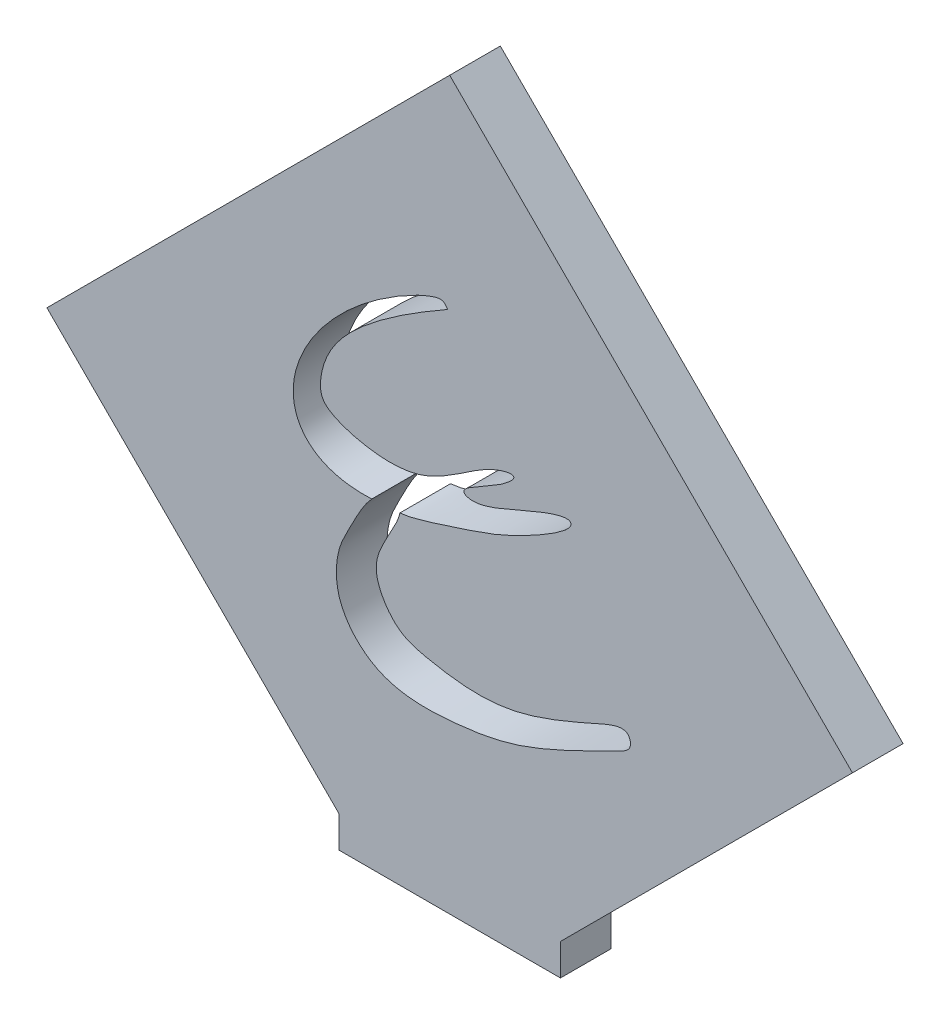
ISO-10303-21;
HEADER;
FILE_DESCRIPTION(('STEP AP214'),'2;1');
FILE_NAME('part.step','',(''),(''),'','','');
FILE_SCHEMA(('AUTOMOTIVE_DESIGN { 1 0 10303 214 1 1 1 1 }'));
ENDSEC;
DATA;
#1=APPLICATION_CONTEXT('core data for automotive mechanical design processes');
#2=APPLICATION_PROTOCOL_DEFINITION('international standard','automotive_design',2000,#1);
#3=PRODUCT_CONTEXT('',#1,'mechanical');
#4=PRODUCT('Part','Part','',(#3));
#5=PRODUCT_RELATED_PRODUCT_CATEGORY('part','',(#4));
#6=PRODUCT_DEFINITION_FORMATION('','',#4);
#7=PRODUCT_DEFINITION_CONTEXT('part definition',#1,'design');
#8=PRODUCT_DEFINITION('design','',#6,#7);
#9=PRODUCT_DEFINITION_SHAPE('','',#8);
#10=(LENGTH_UNIT() NAMED_UNIT(*) SI_UNIT(.MILLI.,.METRE.));
#11=(NAMED_UNIT(*) PLANE_ANGLE_UNIT() SI_UNIT($,.RADIAN.));
#12=(NAMED_UNIT(*) SI_UNIT($,.STERADIAN.) SOLID_ANGLE_UNIT());
#13=UNCERTAINTY_MEASURE_WITH_UNIT(LENGTH_MEASURE(1.E-05),#10,'distance_accuracy_value','');
#14=(GEOMETRIC_REPRESENTATION_CONTEXT(3) GLOBAL_UNCERTAINTY_ASSIGNED_CONTEXT((#13)) GLOBAL_UNIT_ASSIGNED_CONTEXT((#10,
#11,#12)) REPRESENTATION_CONTEXT('',''));
#15=CARTESIAN_POINT('',(0.,0.,0.));
#16=DIRECTION('',(0.,0.,1.));
#17=DIRECTION('',(1.,0.,0.));
#18=AXIS2_PLACEMENT_3D('',#15,#16,#17);
#19=CARTESIAN_POINT('',(0.,0.,8.));
#20=DIRECTION('',(0.,0.,1.));
#21=DIRECTION('',(1.,0.,0.));
#22=AXIS2_PLACEMENT_3D('',#19,#20,#21);
#23=PLANE('',#22);
#24=DIRECTION('',(-0.707106781186548,0.707106781186547,0.));
#25=VECTOR('',#24,1.);
#26=CARTESIAN_POINT('',(-0.0693340825801136,63.7089443893693,8.));
#27=LINE('',#26,#25);
#28=CARTESIAN_POINT('',(63.5702762242092,0.0693340825800998,8.));
#29=VERTEX_POINT('',#28);
#30=CARTESIAN_POINT('',(-0.0693340825801136,63.7089443893693,8.));
#31=VERTEX_POINT('',#30);
#32=EDGE_CURVE('E221',#29,#31,#27,.T.);
#33=ORIENTED_EDGE('',*,*,#32,.T.);
#34=DIRECTION('',(-0.707106781186546,-0.707106781186549,0.));
#35=VECTOR('',#34,1.);
#36=CARTESIAN_POINT('',(-63.7089443893693,0.06933408257985,8.));
#37=LINE('',#36,#35);
#38=CARTESIAN_POINT('',(-63.7089443893693,0.06933408257985,8.));
#39=VERTEX_POINT('',#38);
#40=EDGE_CURVE('E243',#31,#39,#37,.T.);
#41=ORIENTED_EDGE('',*,*,#40,.T.);
#42=DIRECTION('',(0.707106781186548,-0.707106781186547,0.));
#43=VECTOR('',#42,1.);
#44=CARTESIAN_POINT('',(-63.7089443893693,0.06933408257985,8.));
#45=LINE('',#44,#43);
#46=CARTESIAN_POINT('',(-17.56933408258,-46.0702762242094,8.));
#47=VERTEX_POINT('',#46);
#48=EDGE_CURVE('E205',#39,#47,#45,.T.);
#49=ORIENTED_EDGE('',*,*,#48,.T.);
#50=DIRECTION('',(0.,-1.,0.));
#51=VECTOR('',#50,1.);
#52=CARTESIAN_POINT('',(-17.56933408258,-46.0702762242094,8.));
#53=LINE('',#52,#51);
#54=CARTESIAN_POINT('',(-17.56933408258,-51.0702762242094,8.));
#55=VERTEX_POINT('',#54);
#56=EDGE_CURVE('E237',#47,#55,#53,.T.);
#57=ORIENTED_EDGE('',*,*,#56,.T.);
#58=DIRECTION('',(1.,0.,0.));
#59=VECTOR('',#58,1.);
#60=CARTESIAN_POINT('',(-17.56933408258,-51.0702762242094,8.));
#61=LINE('',#60,#59);
#62=CARTESIAN_POINT('',(17.43066591742,-51.0702762242094,8.));
#63=VERTEX_POINT('',#62);
#64=EDGE_CURVE('E239',#55,#63,#61,.T.);
#65=ORIENTED_EDGE('',*,*,#64,.T.);
#66=DIRECTION('',(0.,1.,0.));
#67=VECTOR('',#66,1.);
#68=CARTESIAN_POINT('',(17.43066591742,-46.0702762242094,8.));
#69=LINE('',#68,#67);
#70=CARTESIAN_POINT('',(17.43066591742,-46.0702762242094,8.));
#71=VERTEX_POINT('',#70);
#72=EDGE_CURVE('E241',#63,#71,#69,.T.);
#73=ORIENTED_EDGE('',*,*,#72,.T.);
#74=DIRECTION('',(0.707106781186545,0.707106781186549,0.));
#75=VECTOR('',#74,1.);
#76=CARTESIAN_POINT('',(17.43066591742,-46.0702762242094,8.));
#77=LINE('',#76,#75);
#78=EDGE_CURVE('E226',#71,#29,#77,.T.);
#79=ORIENTED_EDGE('',*,*,#78,.T.);
#80=EDGE_LOOP('',(#33,#41,#49,#57,#65,#73,#79));
#81=FACE_BOUND('',#80,.T.);
#82=CARTESIAN_POINT('',(-1.58217654665239,17.3884658373084,8.));
#83=DIRECTION('',(0.,0.,1.));
#84=DIRECTION('',(0.853569488623824,0.520979009260896,0.));
#85=AXIS2_PLACEMENT_3D('',#82,#83,#84);
#86=ELLIPSE('',#85,25.8691830471738,13.713482714859);
#87=CARTESIAN_POINT('',(-5.11550602780982,31.0925058273637,8.));
#88=VERTEX_POINT('',#87);
#89=CARTESIAN_POINT('',(-12.3824953719832,-0.43170868272888,8.));
#90=VERTEX_POINT('',#89);
#91=EDGE_CURVE('E128',#88,#90,#86,.T.);
#92=ORIENTED_EDGE('',*,*,#91,.F.);
#93=CARTESIAN_POINT('',(-0.39966055408415,31.4940693929427,8.));
#94=CARTESIAN_POINT('',(-0.618855633231517,31.8484479689919,8.));
#95=CARTESIAN_POINT('',(-1.23979288406788,32.8410879647738,8.));
#96=CARTESIAN_POINT('',(-3.58852061835646,31.7840739757048,8.));
#97=CARTESIAN_POINT('',(-5.11550602780982,31.0925058273637,8.));
#98=B_SPLINE_CURVE_WITH_KNOTS('',3,(#93,#94,#95,#96,#97),.UNSPECIFIED.,.F.,.F.,(4,1,4),(0.,
0.351070233263718,1.),.UNSPECIFIED.);
#99=CARTESIAN_POINT('',(-0.39966055408415,31.4940693929427,8.));
#100=VERTEX_POINT('',#99);
#101=EDGE_CURVE('E120',#100,#88,#98,.T.);
#102=ORIENTED_EDGE('',*,*,#101,.F.);
#103=CARTESIAN_POINT('',(-7.94444359129159,-0.123954777810908,8.));
#104=CARTESIAN_POINT('',(-7.35548529124259,-0.044657406099366,8.));
#105=CARTESIAN_POINT('',(-6.1592881884564,0.00362508735828743,8.));
#106=CARTESIAN_POINT('',(4.43318011842619,3.37113917067774,8.));
#107=CARTESIAN_POINT('',(10.6507328326327,5.80962643121534,8.));
#108=CARTESIAN_POINT('',(19.0656596674095,10.677830295029,8.));
#109=CARTESIAN_POINT('',(19.2404675645951,12.7990233106319,8.));
#110=CARTESIAN_POINT('',(13.1416005046621,10.9757048867302,8.));
#111=CARTESIAN_POINT('',(4.67489163592,6.56121876965249,8.));
#112=CARTESIAN_POINT('',(0.720157357289655,8.02667078424179,8.));
#113=CARTESIAN_POINT('',(7.34688998123459,10.9154635918732,8.));
#114=CARTESIAN_POINT('',(11.5804038610338,14.6382677228979,8.));
#115=CARTESIAN_POINT('',(4.78651263142946,13.0543664798374,8.));
#116=CARTESIAN_POINT('',(-3.97409483154029,4.91040578153254,8.));
#117=CARTESIAN_POINT('',(-15.5401127942055,6.45031674266209,8.));
#118=CARTESIAN_POINT('',(-19.9411037430269,8.60899905919083,8.));
#119=CARTESIAN_POINT('',(-20.8039370185811,11.068864087205,8.));
#120=CARTESIAN_POINT('',(-19.1725649329457,19.2972785144401,8.));
#121=CARTESIAN_POINT('',(-9.053580270335,26.5709712545796,8.));
#122=CARTESIAN_POINT('',(-0.39966055408415,31.4940693929427,8.));
#123=B_SPLINE_CURVE_WITH_KNOTS('',3,(#103,#104,#105,#106,#107,#108,#109,#110,#111,#112,#113,
#114,#115,#116,#117,#118,#119,#120,#121,#122),.UNSPECIFIED.,.F.,.F.,(4,1,1,1,1,1,1,1,1,1,1,1,1,
1,1,1,1,4),(0.,0.0312559950108123,0.106776575197118,0.17494506852568,0.245285901071181,
0.267297915196991,0.321808442055245,0.398015463258933,0.429947782163563,0.488177749927124,
0.533801631913126,0.581225243100516,0.664297246696439,0.742642388006175,0.79203250547489,
0.826166158330163,0.887072183381087,1.),.UNSPECIFIED.);
#124=CARTESIAN_POINT('',(-7.94444359129159,-0.123954777810908,8.));
#125=VERTEX_POINT('',#124);
#126=EDGE_CURVE('E142',#125,#100,#123,.T.);
#127=ORIENTED_EDGE('',*,*,#126,.F.);
#128=CARTESIAN_POINT('',(-12.3824953719832,-0.431708682728876,8.));
#129=CARTESIAN_POINT('',(-13.7986022328456,-1.97055214758715,8.));
#130=CARTESIAN_POINT('',(-15.7868407466792,-6.09359978907604,8.));
#131=CARTESIAN_POINT('',(-17.9405534312357,-9.87312001051555,8.));
#132=CARTESIAN_POINT('',(-18.3487372853903,-16.8740558476301,8.));
#133=CARTESIAN_POINT('',(-13.3508183298977,-22.9958590056017,8.));
#134=CARTESIAN_POINT('',(-6.55164235074202,-25.0575506923258,8.));
#135=CARTESIAN_POINT('',(1.88103916026638,-24.5459110296559,8.));
#136=CARTESIAN_POINT('',(11.7791090878672,-22.9525440828905,8.));
#137=CARTESIAN_POINT('',(25.0048666298622,-16.185562887709,8.));
#138=CARTESIAN_POINT('',(28.939487290104,-14.3898234667294,8.));
#139=CARTESIAN_POINT('',(27.9933129273017,-11.1564394009503,8.));
#140=CARTESIAN_POINT('',(21.7571622755817,-14.0903382964739,8.));
#141=CARTESIAN_POINT('',(11.1300642970787,-18.5905582036419,8.));
#142=CARTESIAN_POINT('',(2.76795721536073,-18.9579419549452,8.));
#143=CARTESIAN_POINT('',(-3.45900065433396,-17.9064870154196,8.));
#144=CARTESIAN_POINT('',(-8.24396980164565,-16.7244302527637,8.));
#145=CARTESIAN_POINT('',(-11.6010722153292,-11.981967101515,8.));
#146=CARTESIAN_POINT('',(-12.0817986727102,-7.1933079210198,8.));
#147=CARTESIAN_POINT('',(-8.19303101615814,-1.81160489122846,8.));
#148=CARTESIAN_POINT('',(-7.94444359129159,-0.123954777810908,8.));
#149=B_SPLINE_CURVE_WITH_KNOTS('',3,(#128,#129,#130,#131,#132,#133,#134,#135,#136,#137,#138,
#139,#140,#141,#142,#143,#144,#145,#146,#147,#148),.UNSPECIFIED.,.F.,.F.,(4,1,1,1,1,1,1,1,1,1,1,
1,1,1,1,1,1,1,4),(0.,0.0550027718747757,0.100403302482207,0.155063966851954,0.213544692103513,
0.269816807043135,0.331098512324095,0.401223969811596,0.484628900235301,0.525512755949358,
0.554104145816733,0.605282305107006,0.680677293820084,0.743040172863165,0.796469745133663,
0.843344100613008,0.892769377837001,0.939894921708773,1.),.UNSPECIFIED.);
#150=EDGE_CURVE('E140',#90,#125,#149,.T.);
#151=ORIENTED_EDGE('',*,*,#150,.F.);
#152=EDGE_LOOP('',(#92,#102,#127,#151));
#153=FACE_BOUND('',#152,.T.);
#154=ADVANCED_FACE('F37',(#81,#153),#23,.T.);
#155=CARTESIAN_POINT('',(0.,0.,0.));
#156=DIRECTION('',(0.,0.,1.));
#157=DIRECTION('',(1.,0.,0.));
#158=AXIS2_PLACEMENT_3D('',#155,#156,#157);
#159=PLANE('',#158);
#160=DIRECTION('',(-0.707106781186548,0.707106781186547,0.));
#161=VECTOR('',#160,1.);
#162=CARTESIAN_POINT('',(-0.0693340825801136,63.7089443893693,0.));
#163=LINE('',#162,#161);
#164=CARTESIAN_POINT('',(63.5702762242092,0.0693340825800998,0.));
#165=VERTEX_POINT('',#164);
#166=CARTESIAN_POINT('',(-0.0693340825801136,63.7089443893693,0.));
#167=VERTEX_POINT('',#166);
#168=EDGE_CURVE('E136',#165,#167,#163,.T.);
#169=ORIENTED_EDGE('',*,*,#168,.F.);
#170=DIRECTION('',(0.707106781186545,0.707106781186549,0.));
#171=VECTOR('',#170,1.);
#172=CARTESIAN_POINT('',(17.43066591742,-46.0702762242094,0.));
#173=LINE('',#172,#171);
#174=CARTESIAN_POINT('',(17.43066591742,-46.0702762242094,0.));
#175=VERTEX_POINT('',#174);
#176=EDGE_CURVE('E219',#175,#165,#173,.T.);
#177=ORIENTED_EDGE('',*,*,#176,.F.);
#178=DIRECTION('',(0.,1.,0.));
#179=VECTOR('',#178,1.);
#180=CARTESIAN_POINT('',(17.43066591742,-46.0702762242094,0.));
#181=LINE('',#180,#179);
#182=CARTESIAN_POINT('',(17.43066591742,-51.0702762242094,0.));
#183=VERTEX_POINT('',#182);
#184=EDGE_CURVE('E217',#183,#175,#181,.T.);
#185=ORIENTED_EDGE('',*,*,#184,.F.);
#186=DIRECTION('',(1.,0.,0.));
#187=VECTOR('',#186,1.);
#188=CARTESIAN_POINT('',(-17.56933408258,-51.0702762242094,0.));
#189=LINE('',#188,#187);
#190=CARTESIAN_POINT('',(-17.56933408258,-51.0702762242094,0.));
#191=VERTEX_POINT('',#190);
#192=EDGE_CURVE('E212',#191,#183,#189,.T.);
#193=ORIENTED_EDGE('',*,*,#192,.F.);
#194=DIRECTION('',(0.,-1.,0.));
#195=VECTOR('',#194,1.);
#196=CARTESIAN_POINT('',(-17.56933408258,-46.0702762242094,0.));
#197=LINE('',#196,#195);
#198=CARTESIAN_POINT('',(-17.56933408258,-46.0702762242094,0.));
#199=VERTEX_POINT('',#198);
#200=EDGE_CURVE('E210',#199,#191,#197,.T.);
#201=ORIENTED_EDGE('',*,*,#200,.F.);
#202=DIRECTION('',(0.707106781186548,-0.707106781186547,0.));
#203=VECTOR('',#202,1.);
#204=CARTESIAN_POINT('',(-63.7089443893693,0.06933408257985,0.));
#205=LINE('',#204,#203);
#206=CARTESIAN_POINT('',(-63.7089443893693,0.06933408257985,0.));
#207=VERTEX_POINT('',#206);
#208=EDGE_CURVE('E201',#207,#199,#205,.T.);
#209=ORIENTED_EDGE('',*,*,#208,.F.);
#210=DIRECTION('',(-0.707106781186546,-0.707106781186549,0.));
#211=VECTOR('',#210,1.);
#212=CARTESIAN_POINT('',(-63.7089443893693,0.06933408257985,0.));
#213=LINE('',#212,#211);
#214=EDGE_CURVE('E194',#167,#207,#213,.T.);
#215=ORIENTED_EDGE('',*,*,#214,.F.);
#216=EDGE_LOOP('',(#169,#177,#185,#193,#201,#209,#215));
#217=FACE_BOUND('',#216,.T.);
#218=CARTESIAN_POINT('',(-0.39966055408415,31.4940693929427,0.));
#219=CARTESIAN_POINT('',(-0.618855633231517,31.8484479689919,0.));
#220=CARTESIAN_POINT('',(-1.23979288406788,32.8410879647738,0.));
#221=CARTESIAN_POINT('',(-3.58852061835646,31.7840739757048,0.));
#222=CARTESIAN_POINT('',(-5.11550602780982,31.0925058273637,0.));
#223=B_SPLINE_CURVE_WITH_KNOTS('',3,(#218,#219,#220,#221,#222),.UNSPECIFIED.,.F.,.F.,(4,1,4),
(0.,0.351070233263718,1.),.UNSPECIFIED.);
#224=CARTESIAN_POINT('',(-0.39966055408415,31.4940693929427,0.));
#225=VERTEX_POINT('',#224);
#226=CARTESIAN_POINT('',(-5.11550602780982,31.0925058273637,0.));
#227=VERTEX_POINT('',#226);
#228=EDGE_CURVE('E60',#225,#227,#223,.T.);
#229=ORIENTED_EDGE('',*,*,#228,.T.);
#230=CARTESIAN_POINT('',(-1.58217654665239,17.3884658373084,0.));
#231=DIRECTION('',(0.,0.,1.));
#232=DIRECTION('',(0.853569488623824,0.520979009260896,0.));
#233=AXIS2_PLACEMENT_3D('',#230,#231,#232);
#234=ELLIPSE('',#233,25.8691830471738,13.713482714859);
#235=CARTESIAN_POINT('',(-12.3824953719832,-0.43170868272888,0.));
#236=VERTEX_POINT('',#235);
#237=EDGE_CURVE('E135',#227,#236,#234,.T.);
#238=ORIENTED_EDGE('',*,*,#237,.T.);
#239=CARTESIAN_POINT('',(-12.3824953719832,-0.431708682728876,0.));
#240=CARTESIAN_POINT('',(-13.7986022328456,-1.97055214758715,0.));
#241=CARTESIAN_POINT('',(-15.7868407466792,-6.09359978907604,0.));
#242=CARTESIAN_POINT('',(-17.9405534312357,-9.87312001051555,0.));
#243=CARTESIAN_POINT('',(-18.3487372853903,-16.8740558476301,0.));
#244=CARTESIAN_POINT('',(-13.3508183298977,-22.9958590056017,0.));
#245=CARTESIAN_POINT('',(-6.55164235074202,-25.0575506923258,0.));
#246=CARTESIAN_POINT('',(1.88103916026638,-24.5459110296559,0.));
#247=CARTESIAN_POINT('',(11.7791090878672,-22.9525440828905,0.));
#248=CARTESIAN_POINT('',(25.0048666298622,-16.185562887709,0.));
#249=CARTESIAN_POINT('',(28.939487290104,-14.3898234667294,0.));
#250=CARTESIAN_POINT('',(27.9933129273017,-11.1564394009503,0.));
#251=CARTESIAN_POINT('',(21.7571622755817,-14.0903382964739,0.));
#252=CARTESIAN_POINT('',(11.1300642970787,-18.5905582036419,0.));
#253=CARTESIAN_POINT('',(2.76795721536073,-18.9579419549452,0.));
#254=CARTESIAN_POINT('',(-3.45900065433396,-17.9064870154196,0.));
#255=CARTESIAN_POINT('',(-8.24396980164565,-16.7244302527637,0.));
#256=CARTESIAN_POINT('',(-11.6010722153292,-11.981967101515,0.));
#257=CARTESIAN_POINT('',(-12.0817986727102,-7.1933079210198,0.));
#258=CARTESIAN_POINT('',(-8.19303101615814,-1.81160489122846,0.));
#259=CARTESIAN_POINT('',(-7.94444359129159,-0.123954777810908,0.));
#260=B_SPLINE_CURVE_WITH_KNOTS('',3,(#239,#240,#241,#242,#243,#244,#245,#246,#247,#248,#249,
#250,#251,#252,#253,#254,#255,#256,#257,#258,#259),.UNSPECIFIED.,.F.,.F.,(4,1,1,1,1,1,1,1,1,1,1,
1,1,1,1,1,1,1,4),(0.,0.0550027718747757,0.100403302482207,0.155063966851954,0.213544692103513,
0.269816807043135,0.331098512324095,0.401223969811596,0.484628900235301,0.525512755949358,
0.554104145816733,0.605282305107006,0.680677293820084,0.743040172863165,0.796469745133663,
0.843344100613008,0.892769377837001,0.939894921708773,1.),.UNSPECIFIED.);
#261=CARTESIAN_POINT('',(-7.94444359129159,-0.123954777810908,0.));
#262=VERTEX_POINT('',#261);
#263=EDGE_CURVE('E266',#236,#262,#260,.T.);
#264=ORIENTED_EDGE('',*,*,#263,.T.);
#265=CARTESIAN_POINT('',(-7.94444359129159,-0.123954777810908,0.));
#266=CARTESIAN_POINT('',(-7.35548529124259,-0.044657406099366,0.));
#267=CARTESIAN_POINT('',(-6.1592881884564,0.00362508735828743,0.));
#268=CARTESIAN_POINT('',(4.43318011842619,3.37113917067774,0.));
#269=CARTESIAN_POINT('',(10.6507328326327,5.80962643121534,0.));
#270=CARTESIAN_POINT('',(19.0656596674095,10.677830295029,0.));
#271=CARTESIAN_POINT('',(19.2404675645951,12.7990233106319,0.));
#272=CARTESIAN_POINT('',(13.1416005046621,10.9757048867302,0.));
#273=CARTESIAN_POINT('',(4.67489163592,6.56121876965249,0.));
#274=CARTESIAN_POINT('',(0.720157357289655,8.02667078424179,0.));
#275=CARTESIAN_POINT('',(7.34688998123459,10.9154635918732,0.));
#276=CARTESIAN_POINT('',(11.5804038610338,14.6382677228979,0.));
#277=CARTESIAN_POINT('',(4.78651263142946,13.0543664798374,0.));
#278=CARTESIAN_POINT('',(-3.97409483154029,4.91040578153254,0.));
#279=CARTESIAN_POINT('',(-15.5401127942055,6.45031674266209,0.));
#280=CARTESIAN_POINT('',(-19.9411037430269,8.60899905919083,0.));
#281=CARTESIAN_POINT('',(-20.8039370185811,11.068864087205,0.));
#282=CARTESIAN_POINT('',(-19.1725649329457,19.2972785144401,0.));
#283=CARTESIAN_POINT('',(-9.053580270335,26.5709712545796,0.));
#284=CARTESIAN_POINT('',(-0.39966055408415,31.4940693929427,0.));
#285=B_SPLINE_CURVE_WITH_KNOTS('',3,(#265,#266,#267,#268,#269,#270,#271,#272,#273,#274,#275,
#276,#277,#278,#279,#280,#281,#282,#283,#284),.UNSPECIFIED.,.F.,.F.,(4,1,1,1,1,1,1,1,1,1,1,1,1,
1,1,1,1,4),(0.,0.0312559950108123,0.106776575197118,0.17494506852568,0.245285901071181,
0.267297915196991,0.321808442055245,0.398015463258933,0.429947782163563,0.488177749927124,
0.533801631913126,0.581225243100516,0.664297246696439,0.742642388006175,0.79203250547489,
0.826166158330163,0.887072183381087,1.),.UNSPECIFIED.);
#286=EDGE_CURVE('E129',#262,#225,#285,.T.);
#287=ORIENTED_EDGE('',*,*,#286,.T.);
#288=EDGE_LOOP('',(#229,#238,#264,#287));
#289=FACE_BOUND('',#288,.T.);
#290=ADVANCED_FACE('F163',(#217,#289),#159,.F.);
#291=CARTESIAN_POINT('',(-0.0693340825801136,63.7089443893693,8.));
#292=DIRECTION('',(-0.707106781186547,-0.707106781186549,0.));
#293=DIRECTION('',(0.707106781186549,-0.707106781186547,0.));
#294=AXIS2_PLACEMENT_3D('',#291,#292,#293);
#295=PLANE('',#294);
#296=ORIENTED_EDGE('',*,*,#168,.T.);
#297=DIRECTION('',(0.,0.,-1.));
#298=VECTOR('',#297,1.);
#299=CARTESIAN_POINT('',(-0.0693340825801136,63.7089443893693,8.));
#300=LINE('',#299,#298);
#301=EDGE_CURVE('E11',#31,#167,#300,.T.);
#302=ORIENTED_EDGE('',*,*,#301,.F.);
#303=ORIENTED_EDGE('',*,*,#32,.F.);
#304=DIRECTION('',(0.,0.,-1.));
#305=VECTOR('',#304,1.);
#306=CARTESIAN_POINT('',(63.5702762242092,0.0693340825800998,8.));
#307=LINE('',#306,#305);
#308=EDGE_CURVE('E222',#29,#165,#307,.T.);
#309=ORIENTED_EDGE('',*,*,#308,.T.);
#310=EDGE_LOOP('',(#296,#302,#303,#309));
#311=FACE_BOUND('',#310,.T.);
#312=ADVANCED_FACE('F39',(#311),#295,.F.);
#313=CARTESIAN_POINT('',(-63.7089443893693,0.06933408257985,8.));
#314=DIRECTION('',(0.707106781186549,-0.707106781186546,0.));
#315=DIRECTION('',(0.707106781186546,0.707106781186549,0.));
#316=AXIS2_PLACEMENT_3D('',#313,#314,#315);
#317=PLANE('',#316);
#318=ORIENTED_EDGE('',*,*,#214,.T.);
#319=DIRECTION('',(0.,0.,-1.));
#320=VECTOR('',#319,1.);
#321=CARTESIAN_POINT('',(-63.7089443893693,0.06933408257985,8.));
#322=LINE('',#321,#320);
#323=EDGE_CURVE('E45',#39,#207,#322,.T.);
#324=ORIENTED_EDGE('',*,*,#323,.F.);
#325=ORIENTED_EDGE('',*,*,#40,.F.);
#326=ORIENTED_EDGE('',*,*,#301,.T.);
#327=EDGE_LOOP('',(#318,#324,#325,#326));
#328=FACE_BOUND('',#327,.T.);
#329=ADVANCED_FACE('F185',(#328),#317,.F.);
#330=CARTESIAN_POINT('',(-63.7089443893693,0.06933408257985,8.));
#331=DIRECTION('',(0.707106781186547,0.707106781186548,0.));
#332=DIRECTION('',(-0.707106781186548,0.707106781186547,0.));
#333=AXIS2_PLACEMENT_3D('',#330,#331,#332);
#334=PLANE('',#333);
#335=ORIENTED_EDGE('',*,*,#208,.T.);
#336=DIRECTION('',(0.,0.,-1.));
#337=VECTOR('',#336,1.);
#338=CARTESIAN_POINT('',(-17.56933408258,-46.0702762242094,8.));
#339=LINE('',#338,#337);
#340=EDGE_CURVE('E206',#47,#199,#339,.T.);
#341=ORIENTED_EDGE('',*,*,#340,.F.);
#342=ORIENTED_EDGE('',*,*,#48,.F.);
#343=ORIENTED_EDGE('',*,*,#323,.T.);
#344=EDGE_LOOP('',(#335,#341,#342,#343));
#345=FACE_BOUND('',#344,.T.);
#346=ADVANCED_FACE('F182',(#345),#334,.F.);
#347=CARTESIAN_POINT('',(-17.56933408258,-46.0702762242094,8.));
#348=DIRECTION('',(1.,0.,0.));
#349=DIRECTION('',(0.,1.,0.));
#350=AXIS2_PLACEMENT_3D('',#347,#348,#349);
#351=PLANE('',#350);
#352=ORIENTED_EDGE('',*,*,#200,.T.);
#353=DIRECTION('',(0.,0.,-1.));
#354=VECTOR('',#353,1.);
#355=CARTESIAN_POINT('',(-17.56933408258,-51.0702762242094,8.));
#356=LINE('',#355,#354);
#357=EDGE_CURVE('E232',#55,#191,#356,.T.);
#358=ORIENTED_EDGE('',*,*,#357,.F.);
#359=ORIENTED_EDGE('',*,*,#56,.F.);
#360=ORIENTED_EDGE('',*,*,#340,.T.);
#361=EDGE_LOOP('',(#352,#358,#359,#360));
#362=FACE_BOUND('',#361,.T.);
#363=ADVANCED_FACE('F178',(#362),#351,.F.);
#364=CARTESIAN_POINT('',(-17.56933408258,-51.0702762242094,8.));
#365=DIRECTION('',(0.,1.,0.));
#366=DIRECTION('',(0.,0.,1.));
#367=AXIS2_PLACEMENT_3D('',#364,#365,#366);
#368=PLANE('',#367);
#369=ORIENTED_EDGE('',*,*,#192,.T.);
#370=DIRECTION('',(0.,0.,-1.));
#371=VECTOR('',#370,1.);
#372=CARTESIAN_POINT('',(17.43066591742,-51.0702762242094,8.));
#373=LINE('',#372,#371);
#374=EDGE_CURVE('E229',#63,#183,#373,.T.);
#375=ORIENTED_EDGE('',*,*,#374,.F.);
#376=ORIENTED_EDGE('',*,*,#64,.F.);
#377=ORIENTED_EDGE('',*,*,#357,.T.);
#378=EDGE_LOOP('',(#369,#375,#376,#377));
#379=FACE_BOUND('',#378,.T.);
#380=ADVANCED_FACE('F174',(#379),#368,.F.);
#381=CARTESIAN_POINT('',(17.43066591742,-46.0702762242094,8.));
#382=DIRECTION('',(-1.,0.,0.));
#383=DIRECTION('',(0.,-1.,0.));
#384=AXIS2_PLACEMENT_3D('',#381,#382,#383);
#385=PLANE('',#384);
#386=ORIENTED_EDGE('',*,*,#184,.T.);
#387=DIRECTION('',(0.,0.,-1.));
#388=VECTOR('',#387,1.);
#389=CARTESIAN_POINT('',(17.43066591742,-46.0702762242094,8.));
#390=LINE('',#389,#388);
#391=EDGE_CURVE('E225',#71,#175,#390,.T.);
#392=ORIENTED_EDGE('',*,*,#391,.F.);
#393=ORIENTED_EDGE('',*,*,#72,.F.);
#394=ORIENTED_EDGE('',*,*,#374,.T.);
#395=EDGE_LOOP('',(#386,#392,#393,#394));
#396=FACE_BOUND('',#395,.T.);
#397=ADVANCED_FACE('F170',(#396),#385,.F.);
#398=CARTESIAN_POINT('',(17.43066591742,-46.0702762242094,8.));
#399=DIRECTION('',(-0.70710678118655,0.707106781186546,0.));
#400=DIRECTION('',(-0.707106781186546,-0.70710678118655,0.));
#401=AXIS2_PLACEMENT_3D('',#398,#399,#400);
#402=PLANE('',#401);
#403=ORIENTED_EDGE('',*,*,#176,.T.);
#404=ORIENTED_EDGE('',*,*,#308,.F.);
#405=ORIENTED_EDGE('',*,*,#78,.F.);
#406=ORIENTED_EDGE('',*,*,#391,.T.);
#407=EDGE_LOOP('',(#403,#404,#405,#406));
#408=FACE_BOUND('',#407,.T.);
#409=ADVANCED_FACE('F160',(#408),#402,.F.);
#410=DIRECTION('',(0.,0.,-1.));
#411=VECTOR('',#410,1.);
#412=SURFACE_OF_LINEAR_EXTRUSION('',#98,#411);
#413=ORIENTED_EDGE('',*,*,#228,.F.);
#414=DIRECTION('',(0.,0.,-1.));
#415=VECTOR('',#414,1.);
#416=CARTESIAN_POINT('',(-0.39966055408415,31.4940693929427,8.));
#417=LINE('',#416,#415);
#418=EDGE_CURVE('E124',#100,#225,#417,.T.);
#419=ORIENTED_EDGE('',*,*,#418,.F.);
#420=ORIENTED_EDGE('',*,*,#101,.T.);
#421=DIRECTION('',(0.,0.,-1.));
#422=VECTOR('',#421,1.);
#423=CARTESIAN_POINT('',(-5.11550602780982,31.0925058273637,8.));
#424=LINE('',#423,#422);
#425=EDGE_CURVE('E123',#88,#227,#424,.T.);
#426=ORIENTED_EDGE('',*,*,#425,.T.);
#427=EDGE_LOOP('',(#413,#419,#420,#426));
#428=FACE_BOUND('',#427,.T.);
#429=ADVANCED_FACE('F122',(#428),#412,.T.);
#430=DIRECTION('',(0.,0.,-1.));
#431=VECTOR('',#430,1.);
#432=SURFACE_OF_LINEAR_EXTRUSION('',#86,#431);
#433=ORIENTED_EDGE('',*,*,#237,.F.);
#434=ORIENTED_EDGE('',*,*,#425,.F.);
#435=ORIENTED_EDGE('',*,*,#91,.T.);
#436=DIRECTION('',(0.,0.,-1.));
#437=VECTOR('',#436,1.);
#438=CARTESIAN_POINT('',(-12.3824953719832,-0.43170868272888,8.));
#439=LINE('',#438,#437);
#440=EDGE_CURVE('E137',#90,#236,#439,.T.);
#441=ORIENTED_EDGE('',*,*,#440,.T.);
#442=EDGE_LOOP('',(#433,#434,#435,#441));
#443=FACE_BOUND('',#442,.T.);
#444=ADVANCED_FACE('F132',(#443),#432,.T.);
#445=DIRECTION('',(0.,0.,-1.));
#446=VECTOR('',#445,1.);
#447=SURFACE_OF_LINEAR_EXTRUSION('',#149,#446);
#448=ORIENTED_EDGE('',*,*,#263,.F.);
#449=ORIENTED_EDGE('',*,*,#440,.F.);
#450=ORIENTED_EDGE('',*,*,#150,.T.);
#451=DIRECTION('',(0.,0.,-1.));
#452=VECTOR('',#451,1.);
#453=CARTESIAN_POINT('',(-7.94444359129159,-0.123954777810908,8.));
#454=LINE('',#453,#452);
#455=EDGE_CURVE('E52',#125,#262,#454,.T.);
#456=ORIENTED_EDGE('',*,*,#455,.T.);
#457=EDGE_LOOP('',(#448,#449,#450,#456));
#458=FACE_BOUND('',#457,.T.);
#459=ADVANCED_FACE('F156',(#458),#447,.T.);
#460=DIRECTION('',(0.,0.,-1.));
#461=VECTOR('',#460,1.);
#462=SURFACE_OF_LINEAR_EXTRUSION('',#123,#461);
#463=ORIENTED_EDGE('',*,*,#286,.F.);
#464=ORIENTED_EDGE('',*,*,#455,.F.);
#465=ORIENTED_EDGE('',*,*,#126,.T.);
#466=ORIENTED_EDGE('',*,*,#418,.T.);
#467=EDGE_LOOP('',(#463,#464,#465,#466));
#468=FACE_BOUND('',#467,.T.);
#469=ADVANCED_FACE('F289',(#468),#462,.T.);
#470=CLOSED_SHELL('',(#154,#290,#312,#329,#346,#363,#380,#397,#409,#429,#444,#459,#469));
#471=MANIFOLD_SOLID_BREP('B2',#470);
#472=ADVANCED_BREP_SHAPE_REPRESENTATION('',(#18,#471),#14);
#473=SHAPE_DEFINITION_REPRESENTATION(#9,#472);
ENDSEC;
END-ISO-10303-21;
